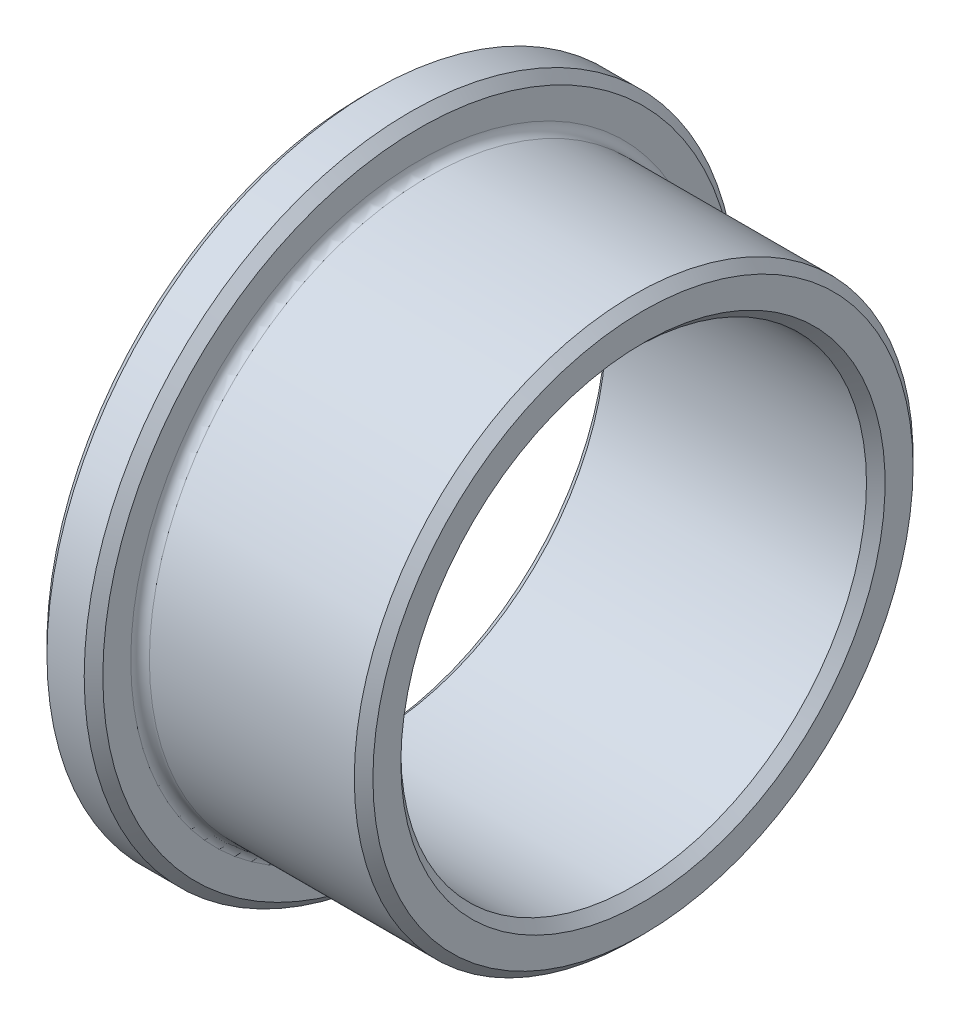
ISO-10303-21;
HEADER;
FILE_DESCRIPTION(('STEP AP214'),'2;1');
FILE_NAME('part.step','',(''),(''),'','','');
FILE_SCHEMA(('AUTOMOTIVE_DESIGN { 1 0 10303 214 1 1 1 1 }'));
ENDSEC;
DATA;
#1=APPLICATION_CONTEXT('core data for automotive mechanical design processes');
#2=APPLICATION_PROTOCOL_DEFINITION('international standard','automotive_design',2000,#1);
#3=PRODUCT_CONTEXT('',#1,'mechanical');
#4=PRODUCT('Part','Part','',(#3));
#5=PRODUCT_RELATED_PRODUCT_CATEGORY('part','',(#4));
#6=PRODUCT_DEFINITION_FORMATION('','',#4);
#7=PRODUCT_DEFINITION_CONTEXT('part definition',#1,'design');
#8=PRODUCT_DEFINITION('design','',#6,#7);
#9=PRODUCT_DEFINITION_SHAPE('','',#8);
#10=(LENGTH_UNIT() NAMED_UNIT(*) SI_UNIT(.MILLI.,.METRE.));
#11=(NAMED_UNIT(*) PLANE_ANGLE_UNIT() SI_UNIT($,.RADIAN.));
#12=(NAMED_UNIT(*) SI_UNIT($,.STERADIAN.) SOLID_ANGLE_UNIT());
#13=UNCERTAINTY_MEASURE_WITH_UNIT(LENGTH_MEASURE(1.E-05),#10,'distance_accuracy_value','');
#14=(GEOMETRIC_REPRESENTATION_CONTEXT(3) GLOBAL_UNCERTAINTY_ASSIGNED_CONTEXT((#13)) GLOBAL_UNIT_ASSIGNED_CONTEXT((#10,
#11,#12)) REPRESENTATION_CONTEXT('',''));
#15=CARTESIAN_POINT('',(0.,0.,0.));
#16=DIRECTION('',(0.,0.,1.));
#17=DIRECTION('',(1.,0.,0.));
#18=AXIS2_PLACEMENT_3D('',#15,#16,#17);
#19=CARTESIAN_POINT('',(0.,35.,0.));
#20=DIRECTION('',(1.,0.,0.));
#21=DIRECTION('',(0.,0.,-1.));
#22=AXIS2_PLACEMENT_3D('',#19,#20,#21);
#23=PLANE('',#22);
#24=CARTESIAN_POINT('',(0.,0.,0.));
#25=DIRECTION('',(1.,0.,0.));
#26=DIRECTION('',(0.,0.,-1.));
#27=AXIS2_PLACEMENT_3D('',#24,#25,#26);
#28=CIRCLE('',#27,26.);
#29=CARTESIAN_POINT('',(0.,0.,-26.));
#30=VERTEX_POINT('',#29);
#31=EDGE_CURVE('E63',#30,#30,#28,.T.);
#32=ORIENTED_EDGE('',*,*,#31,.T.);
#33=EDGE_LOOP('',(#32));
#34=FACE_BOUND('',#33,.T.);
#35=CARTESIAN_POINT('',(0.,0.,0.));
#36=DIRECTION('',(1.,0.,0.));
#37=DIRECTION('',(0.,0.,-1.));
#38=AXIS2_PLACEMENT_3D('',#35,#36,#37);
#39=CIRCLE('',#38,34.);
#40=CARTESIAN_POINT('',(0.,0.,-34.));
#41=VERTEX_POINT('',#40);
#42=EDGE_CURVE('E66',#41,#41,#39,.F.);
#43=ORIENTED_EDGE('',*,*,#42,.T.);
#44=EDGE_LOOP('',(#43));
#45=FACE_BOUND('',#44,.T.);
#46=ADVANCED_FACE('F31',(#34,#45),#23,.F.);
#47=CARTESIAN_POINT('',(0.,0.,0.));
#48=DIRECTION('',(-1.,0.,0.));
#49=DIRECTION('',(0.,0.,1.));
#50=AXIS2_PLACEMENT_3D('',#47,#48,#49);
#51=CYLINDRICAL_SURFACE('',#50,25.);
#52=CARTESIAN_POINT('',(1.00000000000001,0.,0.));
#53=DIRECTION('',(1.,0.,0.));
#54=DIRECTION('',(0.,0.,-1.));
#55=AXIS2_PLACEMENT_3D('',#52,#53,#54);
#56=CIRCLE('',#55,25.);
#57=CARTESIAN_POINT('',(1.00000000000001,0.,-25.));
#58=VERTEX_POINT('',#57);
#59=EDGE_CURVE('E69',#58,#58,#56,.F.);
#60=ORIENTED_EDGE('',*,*,#59,.T.);
#61=EDGE_LOOP('',(#60));
#62=FACE_BOUND('',#61,.T.);
#63=CARTESIAN_POINT('',(29.,0.,0.));
#64=DIRECTION('',(-1.,0.,0.));
#65=DIRECTION('',(0.,0.,1.));
#66=AXIS2_PLACEMENT_3D('',#63,#64,#65);
#67=CIRCLE('',#66,25.);
#68=CARTESIAN_POINT('',(29.,0.,25.));
#69=VERTEX_POINT('',#68);
#70=EDGE_CURVE('E72',#69,#69,#67,.F.);
#71=ORIENTED_EDGE('',*,*,#70,.T.);
#72=EDGE_LOOP('',(#71));
#73=FACE_BOUND('',#72,.T.);
#74=ADVANCED_FACE('F76',(#62,#73),#51,.F.);
#75=CARTESIAN_POINT('',(30.,25.,0.));
#76=DIRECTION('',(-1.,0.,0.));
#77=DIRECTION('',(0.,0.,1.));
#78=AXIS2_PLACEMENT_3D('',#75,#76,#77);
#79=PLANE('',#78);
#80=CARTESIAN_POINT('',(30.,0.,0.));
#81=DIRECTION('',(-1.,0.,0.));
#82=DIRECTION('',(0.,0.,1.));
#83=AXIS2_PLACEMENT_3D('',#80,#81,#82);
#84=CIRCLE('',#83,26.);
#85=CARTESIAN_POINT('',(30.,0.,26.));
#86=VERTEX_POINT('',#85);
#87=EDGE_CURVE('E57',#86,#86,#84,.T.);
#88=ORIENTED_EDGE('',*,*,#87,.T.);
#89=EDGE_LOOP('',(#88));
#90=FACE_BOUND('',#89,.T.);
#91=CARTESIAN_POINT('',(30.,0.,0.));
#92=DIRECTION('',(-1.,0.,0.));
#93=DIRECTION('',(0.,0.,1.));
#94=AXIS2_PLACEMENT_3D('',#91,#92,#93);
#95=CIRCLE('',#94,29.);
#96=CARTESIAN_POINT('',(30.,0.,29.));
#97=VERTEX_POINT('',#96);
#98=EDGE_CURVE('E60',#97,#97,#95,.F.);
#99=ORIENTED_EDGE('',*,*,#98,.T.);
#100=EDGE_LOOP('',(#99));
#101=FACE_BOUND('',#100,.T.);
#102=ADVANCED_FACE('F86',(#90,#101),#79,.F.);
#103=CARTESIAN_POINT('',(0.,0.,0.));
#104=DIRECTION('',(-1.,0.,0.));
#105=DIRECTION('',(0.,0.,1.));
#106=AXIS2_PLACEMENT_3D('',#103,#104,#105);
#107=CYLINDRICAL_SURFACE('',#106,30.);
#108=CARTESIAN_POINT('',(7.,0.,0.));
#109=DIRECTION('',(-1.,0.,0.));
#110=DIRECTION('',(0.,0.,1.));
#111=AXIS2_PLACEMENT_3D('',#108,#109,#110);
#112=CIRCLE('',#111,30.);
#113=CARTESIAN_POINT('',(7.,0.,30.));
#114=VERTEX_POINT('',#113);
#115=EDGE_CURVE('E10',#114,#114,#112,.F.);
#116=ORIENTED_EDGE('',*,*,#115,.T.);
#117=EDGE_LOOP('',(#116));
#118=FACE_BOUND('',#117,.T.);
#119=CARTESIAN_POINT('',(29.,0.,0.));
#120=DIRECTION('',(-1.,0.,0.));
#121=DIRECTION('',(0.,0.,1.));
#122=AXIS2_PLACEMENT_3D('',#119,#120,#121);
#123=CIRCLE('',#122,30.);
#124=CARTESIAN_POINT('',(29.,0.,30.));
#125=VERTEX_POINT('',#124);
#126=EDGE_CURVE('E42',#125,#125,#123,.T.);
#127=ORIENTED_EDGE('',*,*,#126,.T.);
#128=EDGE_LOOP('',(#127));
#129=FACE_BOUND('',#128,.T.);
#130=ADVANCED_FACE('F89',(#118,#129),#107,.T.);
#131=CARTESIAN_POINT('',(6.,30.,0.));
#132=DIRECTION('',(-1.,0.,0.));
#133=DIRECTION('',(0.,0.,1.));
#134=AXIS2_PLACEMENT_3D('',#131,#132,#133);
#135=PLANE('',#134);
#136=CARTESIAN_POINT('',(6.,0.,0.));
#137=DIRECTION('',(-1.,0.,0.));
#138=DIRECTION('',(0.,0.,1.));
#139=AXIS2_PLACEMENT_3D('',#136,#137,#138);
#140=CIRCLE('',#139,31.);
#141=CARTESIAN_POINT('',(6.,0.,31.));
#142=VERTEX_POINT('',#141);
#143=EDGE_CURVE('E38',#142,#142,#140,.T.);
#144=ORIENTED_EDGE('',*,*,#143,.T.);
#145=EDGE_LOOP('',(#144));
#146=FACE_BOUND('',#145,.T.);
#147=CARTESIAN_POINT('',(6.,0.,0.));
#148=DIRECTION('',(-1.,0.,0.));
#149=DIRECTION('',(0.,0.,1.));
#150=AXIS2_PLACEMENT_3D('',#147,#148,#149);
#151=CIRCLE('',#150,34.);
#152=CARTESIAN_POINT('',(6.,0.,34.));
#153=VERTEX_POINT('',#152);
#154=EDGE_CURVE('E46',#153,#153,#151,.F.);
#155=ORIENTED_EDGE('',*,*,#154,.T.);
#156=EDGE_LOOP('',(#155));
#157=FACE_BOUND('',#156,.T.);
#158=ADVANCED_FACE('F100',(#146,#157),#135,.F.);
#159=CARTESIAN_POINT('',(0.,0.,0.));
#160=DIRECTION('',(-1.,0.,0.));
#161=DIRECTION('',(0.,0.,1.));
#162=AXIS2_PLACEMENT_3D('',#159,#160,#161);
#163=CYLINDRICAL_SURFACE('',#162,35.);
#164=CARTESIAN_POINT('',(4.99999999999999,0.,0.));
#165=DIRECTION('',(-1.,0.,0.));
#166=DIRECTION('',(0.,0.,1.));
#167=AXIS2_PLACEMENT_3D('',#164,#165,#166);
#168=CIRCLE('',#167,35.);
#169=CARTESIAN_POINT('',(4.99999999999999,0.,35.));
#170=VERTEX_POINT('',#169);
#171=EDGE_CURVE('E51',#170,#170,#168,.T.);
#172=ORIENTED_EDGE('',*,*,#171,.T.);
#173=EDGE_LOOP('',(#172));
#174=FACE_BOUND('',#173,.T.);
#175=CARTESIAN_POINT('',(1.,0.,0.));
#176=DIRECTION('',(1.,0.,0.));
#177=DIRECTION('',(0.,0.,-1.));
#178=AXIS2_PLACEMENT_3D('',#175,#176,#177);
#179=CIRCLE('',#178,35.);
#180=CARTESIAN_POINT('',(1.,0.,-35.));
#181=VERTEX_POINT('',#180);
#182=EDGE_CURVE('E54',#181,#181,#179,.T.);
#183=ORIENTED_EDGE('',*,*,#182,.T.);
#184=EDGE_LOOP('',(#183));
#185=FACE_BOUND('',#184,.T.);
#186=ADVANCED_FACE('F105',(#174,#185),#163,.T.);
#187=CARTESIAN_POINT('',(1.00000000000001,0.,0.));
#188=DIRECTION('',(-1.,0.,0.));
#189=DIRECTION('',(0.,0.,1.));
#190=AXIS2_PLACEMENT_3D('',#187,#188,#189);
#191=CONICAL_SURFACE('',#190,25.,0.785398163397447);
#192=ORIENTED_EDGE('',*,*,#31,.F.);
#193=EDGE_LOOP('',(#192));
#194=FACE_BOUND('',#193,.T.);
#195=ORIENTED_EDGE('',*,*,#59,.F.);
#196=EDGE_LOOP('',(#195));
#197=FACE_BOUND('',#196,.T.);
#198=ADVANCED_FACE('F82',(#194,#197),#191,.F.);
#199=CARTESIAN_POINT('',(30.,0.,0.));
#200=DIRECTION('',(1.,0.,0.));
#201=DIRECTION('',(0.,0.,-1.));
#202=AXIS2_PLACEMENT_3D('',#199,#200,#201);
#203=CONICAL_SURFACE('',#202,26.,0.785398163397443);
#204=ORIENTED_EDGE('',*,*,#70,.F.);
#205=EDGE_LOOP('',(#204));
#206=FACE_BOUND('',#205,.T.);
#207=ORIENTED_EDGE('',*,*,#87,.F.);
#208=EDGE_LOOP('',(#207));
#209=FACE_BOUND('',#208,.T.);
#210=ADVANCED_FACE('F78',(#206,#209),#203,.F.);
#211=CARTESIAN_POINT('',(4.99999999999999,0.,0.));
#212=DIRECTION('',(-1.,0.,0.));
#213=DIRECTION('',(0.,0.,1.));
#214=AXIS2_PLACEMENT_3D('',#211,#212,#213);
#215=CONICAL_SURFACE('',#214,35.,0.785398163397452);
#216=ORIENTED_EDGE('',*,*,#154,.F.);
#217=EDGE_LOOP('',(#216));
#218=FACE_BOUND('',#217,.T.);
#219=ORIENTED_EDGE('',*,*,#171,.F.);
#220=EDGE_LOOP('',(#219));
#221=FACE_BOUND('',#220,.T.);
#222=ADVANCED_FACE('F81',(#218,#221),#215,.T.);
#223=CARTESIAN_POINT('',(0.,0.,0.));
#224=DIRECTION('',(1.,0.,0.));
#225=DIRECTION('',(0.,0.,-1.));
#226=AXIS2_PLACEMENT_3D('',#223,#224,#225);
#227=CONICAL_SURFACE('',#226,34.,0.785398163397448);
#228=ORIENTED_EDGE('',*,*,#182,.F.);
#229=EDGE_LOOP('',(#228));
#230=FACE_BOUND('',#229,.T.);
#231=ORIENTED_EDGE('',*,*,#42,.F.);
#232=EDGE_LOOP('',(#231));
#233=FACE_BOUND('',#232,.T.);
#234=ADVANCED_FACE('F96',(#230,#233),#227,.T.);
#235=CARTESIAN_POINT('',(29.,0.,0.));
#236=DIRECTION('',(-1.,0.,0.));
#237=DIRECTION('',(0.,0.,1.));
#238=AXIS2_PLACEMENT_3D('',#235,#236,#237);
#239=CONICAL_SURFACE('',#238,30.,0.785398163397445);
#240=ORIENTED_EDGE('',*,*,#98,.F.);
#241=EDGE_LOOP('',(#240));
#242=FACE_BOUND('',#241,.T.);
#243=ORIENTED_EDGE('',*,*,#126,.F.);
#244=EDGE_LOOP('',(#243));
#245=FACE_BOUND('',#244,.T.);
#246=ADVANCED_FACE('F93',(#242,#245),#239,.T.);
#247=CARTESIAN_POINT('',(7.,0.,0.));
#248=DIRECTION('',(-1.,0.,0.));
#249=DIRECTION('',(0.,0.,1.));
#250=AXIS2_PLACEMENT_3D('',#247,#248,#249);
#251=TOROIDAL_SURFACE('',#250,31.,1.);
#252=ORIENTED_EDGE('',*,*,#115,.F.);
#253=EDGE_LOOP('',(#252));
#254=FACE_BOUND('',#253,.T.);
#255=ORIENTED_EDGE('',*,*,#143,.F.);
#256=EDGE_LOOP('',(#255));
#257=FACE_BOUND('',#256,.T.);
#258=ADVANCED_FACE('F33',(#254,#257),#251,.F.);
#259=CLOSED_SHELL('',(#46,#74,#102,#130,#158,#186,#198,#210,#222,#234,#246,#258));
#260=MANIFOLD_SOLID_BREP('B2',#259);
#261=ADVANCED_BREP_SHAPE_REPRESENTATION('',(#18,#260),#14);
#262=SHAPE_DEFINITION_REPRESENTATION(#9,#261);
ENDSEC;
END-ISO-10303-21;
